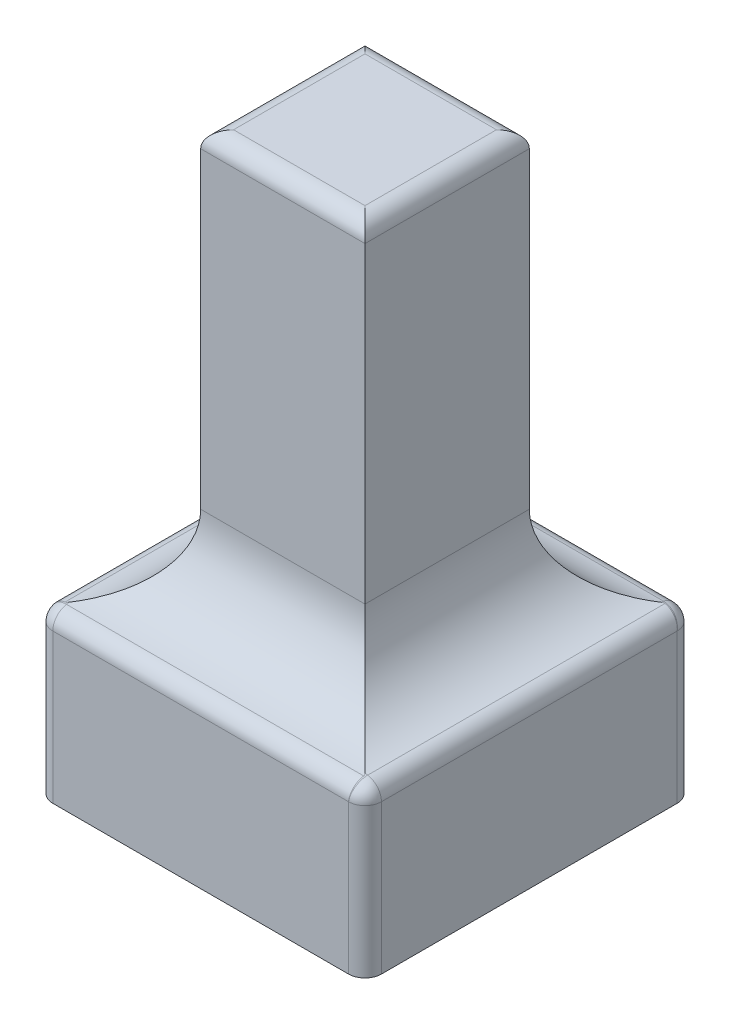
ISO-10303-21;
HEADER;
FILE_DESCRIPTION(('STEP AP214'),'2;1');
FILE_NAME('part.step','',(''),(''),'','','');
FILE_SCHEMA(('AUTOMOTIVE_DESIGN { 1 0 10303 214 1 1 1 1 }'));
ENDSEC;
DATA;
#1=APPLICATION_CONTEXT('core data for automotive mechanical design processes');
#2=APPLICATION_PROTOCOL_DEFINITION('international standard','automotive_design',2000,#1);
#3=PRODUCT_CONTEXT('',#1,'mechanical');
#4=PRODUCT('Part','Part','',(#3));
#5=PRODUCT_RELATED_PRODUCT_CATEGORY('part','',(#4));
#6=PRODUCT_DEFINITION_FORMATION('','',#4);
#7=PRODUCT_DEFINITION_CONTEXT('part definition',#1,'design');
#8=PRODUCT_DEFINITION('design','',#6,#7);
#9=PRODUCT_DEFINITION_SHAPE('','',#8);
#10=(LENGTH_UNIT() NAMED_UNIT(*) SI_UNIT(.MILLI.,.METRE.));
#11=(NAMED_UNIT(*) PLANE_ANGLE_UNIT() SI_UNIT($,.RADIAN.));
#12=(NAMED_UNIT(*) SI_UNIT($,.STERADIAN.) SOLID_ANGLE_UNIT());
#13=UNCERTAINTY_MEASURE_WITH_UNIT(LENGTH_MEASURE(1.E-05),#10,'distance_accuracy_value','');
#14=(GEOMETRIC_REPRESENTATION_CONTEXT(3) GLOBAL_UNCERTAINTY_ASSIGNED_CONTEXT((#13)) GLOBAL_UNIT_ASSIGNED_CONTEXT((#10,
#11,#12)) REPRESENTATION_CONTEXT('',''));
#15=CARTESIAN_POINT('',(0.,0.,0.));
#16=DIRECTION('',(0.,0.,1.));
#17=DIRECTION('',(1.,0.,0.));
#18=AXIS2_PLACEMENT_3D('',#15,#16,#17);
#19=CARTESIAN_POINT('',(10.,35.,10.));
#20=DIRECTION('',(-1.,0.,0.));
#21=DIRECTION('',(0.,0.,1.));
#22=AXIS2_PLACEMENT_3D('',#19,#20,#21);
#23=PLANE('',#22);
#24=DIRECTION('',(0.,-1.,0.));
#25=VECTOR('',#24,1.);
#26=CARTESIAN_POINT('',(10.,35.,-9.));
#27=LINE('',#26,#25);
#28=CARTESIAN_POINT('',(10.,0.,-9.));
#29=VERTEX_POINT('',#28);
#30=CARTESIAN_POINT('',(10.,9.08392021690038,-9.));
#31=VERTEX_POINT('',#30);
#32=EDGE_CURVE('E262',#29,#31,#27,.F.);
#33=ORIENTED_EDGE('',*,*,#32,.T.);
#34=DIRECTION('',(0.,0.,1.));
#35=VECTOR('',#34,1.);
#36=CARTESIAN_POINT('',(10.,9.08392021690038,10.));
#37=LINE('',#36,#35);
#38=CARTESIAN_POINT('',(10.,9.08392021690038,9.));
#39=VERTEX_POINT('',#38);
#40=EDGE_CURVE('E488',#31,#39,#37,.T.);
#41=ORIENTED_EDGE('',*,*,#40,.T.);
#42=DIRECTION('',(0.,-1.,0.));
#43=VECTOR('',#42,1.);
#44=CARTESIAN_POINT('',(10.,35.,9.));
#45=LINE('',#44,#43);
#46=CARTESIAN_POINT('',(10.,0.,9.));
#47=VERTEX_POINT('',#46);
#48=EDGE_CURVE('E260',#39,#47,#45,.T.);
#49=ORIENTED_EDGE('',*,*,#48,.T.);
#50=DIRECTION('',(0.,0.,-1.));
#51=VECTOR('',#50,1.);
#52=CARTESIAN_POINT('',(10.,0.,10.));
#53=LINE('',#52,#51);
#54=EDGE_CURVE('E772',#47,#29,#53,.T.);
#55=ORIENTED_EDGE('',*,*,#54,.T.);
#56=EDGE_LOOP('',(#33,#41,#49,#55));
#57=FACE_BOUND('',#56,.T.);
#58=ADVANCED_FACE('F36',(#57),#23,.F.);
#59=CARTESIAN_POINT('',(-9.99999999999999,35.,-10.));
#60=DIRECTION('',(0.,0.,1.));
#61=DIRECTION('',(1.,0.,0.));
#62=AXIS2_PLACEMENT_3D('',#59,#60,#61);
#63=PLANE('',#62);
#64=DIRECTION('',(0.,-1.,0.));
#65=VECTOR('',#64,1.);
#66=CARTESIAN_POINT('',(-8.99999999999999,35.,-10.));
#67=LINE('',#66,#65);
#68=CARTESIAN_POINT('',(-8.99999999999999,0.,-10.));
#69=VERTEX_POINT('',#68);
#70=CARTESIAN_POINT('',(-8.99999999999999,9.08392021690038,-10.));
#71=VERTEX_POINT('',#70);
#72=EDGE_CURVE('E248',#69,#71,#67,.F.);
#73=ORIENTED_EDGE('',*,*,#72,.T.);
#74=DIRECTION('',(1.,0.,0.));
#75=VECTOR('',#74,1.);
#76=CARTESIAN_POINT('',(-9.99999999999999,9.08392021690038,-10.));
#77=LINE('',#76,#75);
#78=CARTESIAN_POINT('',(9.00000000000001,9.08392021690038,-10.));
#79=VERTEX_POINT('',#78);
#80=EDGE_CURVE('E503',#71,#79,#77,.T.);
#81=ORIENTED_EDGE('',*,*,#80,.T.);
#82=DIRECTION('',(0.,-1.,0.));
#83=VECTOR('',#82,1.);
#84=CARTESIAN_POINT('',(9.00000000000001,35.,-10.));
#85=LINE('',#84,#83);
#86=CARTESIAN_POINT('',(9.00000000000001,0.,-10.));
#87=VERTEX_POINT('',#86);
#88=EDGE_CURVE('E250',#79,#87,#85,.T.);
#89=ORIENTED_EDGE('',*,*,#88,.T.);
#90=DIRECTION('',(-1.,0.,0.));
#91=VECTOR('',#90,1.);
#92=CARTESIAN_POINT('',(-9.99999999999999,0.,-10.));
#93=LINE('',#92,#91);
#94=EDGE_CURVE('E779',#87,#69,#93,.T.);
#95=ORIENTED_EDGE('',*,*,#94,.T.);
#96=EDGE_LOOP('',(#73,#81,#89,#95));
#97=FACE_BOUND('',#96,.T.);
#98=ADVANCED_FACE('F374',(#97),#63,.F.);
#99=CARTESIAN_POINT('',(-9.99999999999999,35.,10.));
#100=DIRECTION('',(1.,0.,0.));
#101=DIRECTION('',(0.,0.,-1.));
#102=AXIS2_PLACEMENT_3D('',#99,#100,#101);
#103=PLANE('',#102);
#104=DIRECTION('',(0.,-1.,0.));
#105=VECTOR('',#104,1.);
#106=CARTESIAN_POINT('',(-9.99999999999999,35.,9.));
#107=LINE('',#106,#105);
#108=CARTESIAN_POINT('',(-9.99999999999999,0.,9.));
#109=VERTEX_POINT('',#108);
#110=CARTESIAN_POINT('',(-9.99999999999999,9.08392021690038,9.));
#111=VERTEX_POINT('',#110);
#112=EDGE_CURVE('E272',#109,#111,#107,.F.);
#113=ORIENTED_EDGE('',*,*,#112,.T.);
#114=DIRECTION('',(0.,0.,-1.));
#115=VECTOR('',#114,1.);
#116=CARTESIAN_POINT('',(-9.99999999999999,9.08392021690038,10.));
#117=LINE('',#116,#115);
#118=CARTESIAN_POINT('',(-9.99999999999999,9.08392021690038,-9.));
#119=VERTEX_POINT('',#118);
#120=EDGE_CURVE('E12',#111,#119,#117,.T.);
#121=ORIENTED_EDGE('',*,*,#120,.T.);
#122=DIRECTION('',(0.,-1.,0.));
#123=VECTOR('',#122,1.);
#124=CARTESIAN_POINT('',(-9.99999999999999,35.,-9.));
#125=LINE('',#124,#123);
#126=CARTESIAN_POINT('',(-9.99999999999999,0.,-9.));
#127=VERTEX_POINT('',#126);
#128=EDGE_CURVE('E270',#119,#127,#125,.T.);
#129=ORIENTED_EDGE('',*,*,#128,.T.);
#130=DIRECTION('',(0.,0.,1.));
#131=VECTOR('',#130,1.);
#132=CARTESIAN_POINT('',(-9.99999999999999,0.,10.));
#133=LINE('',#132,#131);
#134=EDGE_CURVE('E218',#127,#109,#133,.T.);
#135=ORIENTED_EDGE('',*,*,#134,.T.);
#136=EDGE_LOOP('',(#113,#121,#129,#135));
#137=FACE_BOUND('',#136,.T.);
#138=ADVANCED_FACE('F380',(#137),#103,.F.);
#139=CARTESIAN_POINT('',(-9.99999999999999,35.,10.));
#140=DIRECTION('',(0.,0.,-1.));
#141=DIRECTION('',(-1.,0.,0.));
#142=AXIS2_PLACEMENT_3D('',#139,#140,#141);
#143=PLANE('',#142);
#144=DIRECTION('',(0.,-1.,0.));
#145=VECTOR('',#144,1.);
#146=CARTESIAN_POINT('',(9.00000000000001,35.,10.));
#147=LINE('',#146,#145);
#148=CARTESIAN_POINT('',(9.00000000000001,0.,10.));
#149=VERTEX_POINT('',#148);
#150=CARTESIAN_POINT('',(9.00000000000001,9.08392021690038,10.));
#151=VERTEX_POINT('',#150);
#152=EDGE_CURVE('E267',#149,#151,#147,.F.);
#153=ORIENTED_EDGE('',*,*,#152,.T.);
#154=DIRECTION('',(-1.,0.,0.));
#155=VECTOR('',#154,1.);
#156=CARTESIAN_POINT('',(-9.99999999999999,9.08392021690038,10.));
#157=LINE('',#156,#155);
#158=CARTESIAN_POINT('',(-8.99999999999999,9.08392021690038,10.));
#159=VERTEX_POINT('',#158);
#160=EDGE_CURVE('E45',#151,#159,#157,.T.);
#161=ORIENTED_EDGE('',*,*,#160,.T.);
#162=DIRECTION('',(0.,-1.,0.));
#163=VECTOR('',#162,1.);
#164=CARTESIAN_POINT('',(-8.99999999999999,35.,10.));
#165=LINE('',#164,#163);
#166=CARTESIAN_POINT('',(-8.99999999999999,0.,10.));
#167=VERTEX_POINT('',#166);
#168=EDGE_CURVE('E265',#159,#167,#165,.T.);
#169=ORIENTED_EDGE('',*,*,#168,.T.);
#170=DIRECTION('',(1.,0.,0.));
#171=VECTOR('',#170,1.);
#172=CARTESIAN_POINT('',(-9.99999999999999,0.,10.));
#173=LINE('',#172,#171);
#174=EDGE_CURVE('E215',#167,#149,#173,.T.);
#175=ORIENTED_EDGE('',*,*,#174,.T.);
#176=EDGE_LOOP('',(#153,#161,#169,#175));
#177=FACE_BOUND('',#176,.T.);
#178=ADVANCED_FACE('F483',(#177),#143,.F.);
#179=CARTESIAN_POINT('',(0.,0.,0.));
#180=DIRECTION('',(0.,-1.,0.));
#181=DIRECTION('',(0.,0.,-1.));
#182=AXIS2_PLACEMENT_3D('',#179,#180,#181);
#183=PLANE('',#182);
#184=ORIENTED_EDGE('',*,*,#94,.F.);
#185=CARTESIAN_POINT('',(9.00000000000001,0.,-9.));
#186=DIRECTION('',(0.,-1.,0.));
#187=DIRECTION('',(0.,0.,-1.));
#188=AXIS2_PLACEMENT_3D('',#185,#186,#187);
#189=CIRCLE('',#188,1.);
#190=EDGE_CURVE('E258',#87,#29,#189,.T.);
#191=ORIENTED_EDGE('',*,*,#190,.T.);
#192=ORIENTED_EDGE('',*,*,#54,.F.);
#193=CARTESIAN_POINT('',(9.00000000000001,0.,9.));
#194=DIRECTION('',(0.,-1.,0.));
#195=DIRECTION('',(0.,0.,-1.));
#196=AXIS2_PLACEMENT_3D('',#193,#194,#195);
#197=CIRCLE('',#196,1.);
#198=EDGE_CURVE('E256',#47,#149,#197,.T.);
#199=ORIENTED_EDGE('',*,*,#198,.T.);
#200=ORIENTED_EDGE('',*,*,#174,.F.);
#201=CARTESIAN_POINT('',(-8.99999999999999,0.,9.));
#202=DIRECTION('',(0.,-1.,0.));
#203=DIRECTION('',(0.,0.,-1.));
#204=AXIS2_PLACEMENT_3D('',#201,#202,#203);
#205=CIRCLE('',#204,1.);
#206=EDGE_CURVE('E254',#167,#109,#205,.T.);
#207=ORIENTED_EDGE('',*,*,#206,.T.);
#208=ORIENTED_EDGE('',*,*,#134,.F.);
#209=CARTESIAN_POINT('',(-8.99999999999999,0.,-9.));
#210=DIRECTION('',(0.,-1.,0.));
#211=DIRECTION('',(0.,0.,-1.));
#212=AXIS2_PLACEMENT_3D('',#209,#210,#211);
#213=CIRCLE('',#212,1.);
#214=EDGE_CURVE('E252',#127,#69,#213,.T.);
#215=ORIENTED_EDGE('',*,*,#214,.T.);
#216=EDGE_LOOP('',(#184,#191,#192,#199,#200,#207,#208,#215));
#217=FACE_BOUND('',#216,.T.);
#218=ADVANCED_FACE('F695',(#217),#183,.T.);
#219=CARTESIAN_POINT('',(-5.,35.,5.));
#220=DIRECTION('',(-1.,0.,0.));
#221=DIRECTION('',(0.,0.,1.));
#222=AXIS2_PLACEMENT_3D('',#219,#220,#221);
#223=PLANE('',#222);
#224=DIRECTION('',(0.,-1.,0.));
#225=VECTOR('',#224,1.);
#226=CARTESIAN_POINT('',(-5.,35.,5.));
#227=LINE('',#226,#225);
#228=CARTESIAN_POINT('',(-5.,34.,5.));
#229=VERTEX_POINT('',#228);
#230=CARTESIAN_POINT('',(-5.,15.,5.));
#231=VERTEX_POINT('',#230);
#232=EDGE_CURVE('E769',#229,#231,#227,.T.);
#233=ORIENTED_EDGE('',*,*,#232,.F.);
#234=DIRECTION('',(0.,0.,-1.));
#235=VECTOR('',#234,1.);
#236=CARTESIAN_POINT('',(-5.,34.,-5.));
#237=LINE('',#236,#235);
#238=CARTESIAN_POINT('',(-5.,34.,-5.));
#239=VERTEX_POINT('',#238);
#240=EDGE_CURVE('E226',#229,#239,#237,.T.);
#241=ORIENTED_EDGE('',*,*,#240,.T.);
#242=DIRECTION('',(0.,-1.,0.));
#243=VECTOR('',#242,1.);
#244=CARTESIAN_POINT('',(-5.,35.,-5.));
#245=LINE('',#244,#243);
#246=CARTESIAN_POINT('',(-5.,15.,-5.));
#247=VERTEX_POINT('',#246);
#248=EDGE_CURVE('E204',#239,#247,#245,.T.);
#249=ORIENTED_EDGE('',*,*,#248,.T.);
#250=DIRECTION('',(0.,0.,-1.));
#251=VECTOR('',#250,1.);
#252=CARTESIAN_POINT('',(-5.,15.,5.));
#253=LINE('',#252,#251);
#254=EDGE_CURVE('E223',#247,#231,#253,.F.);
#255=ORIENTED_EDGE('',*,*,#254,.T.);
#256=EDGE_LOOP('',(#233,#241,#249,#255));
#257=FACE_BOUND('',#256,.T.);
#258=ADVANCED_FACE('F686',(#257),#223,.T.);
#259=CARTESIAN_POINT('',(5.,35.,5.));
#260=DIRECTION('',(0.,0.,1.));
#261=DIRECTION('',(1.,0.,0.));
#262=AXIS2_PLACEMENT_3D('',#259,#260,#261);
#263=PLANE('',#262);
#264=DIRECTION('',(0.,-1.,0.));
#265=VECTOR('',#264,1.);
#266=CARTESIAN_POINT('',(5.,35.,5.));
#267=LINE('',#266,#265);
#268=CARTESIAN_POINT('',(5.,34.,5.));
#269=VERTEX_POINT('',#268);
#270=CARTESIAN_POINT('',(5.,15.,5.));
#271=VERTEX_POINT('',#270);
#272=EDGE_CURVE('E203',#269,#271,#267,.T.);
#273=ORIENTED_EDGE('',*,*,#272,.F.);
#274=DIRECTION('',(-1.,0.,0.));
#275=VECTOR('',#274,1.);
#276=CARTESIAN_POINT('',(-5.,34.,5.));
#277=LINE('',#276,#275);
#278=EDGE_CURVE('E244',#269,#229,#277,.T.);
#279=ORIENTED_EDGE('',*,*,#278,.T.);
#280=ORIENTED_EDGE('',*,*,#232,.T.);
#281=DIRECTION('',(-1.,0.,0.));
#282=VECTOR('',#281,1.);
#283=CARTESIAN_POINT('',(5.,15.,5.));
#284=LINE('',#283,#282);
#285=EDGE_CURVE('E210',#231,#271,#284,.F.);
#286=ORIENTED_EDGE('',*,*,#285,.T.);
#287=EDGE_LOOP('',(#273,#279,#280,#286));
#288=FACE_BOUND('',#287,.T.);
#289=ADVANCED_FACE('F678',(#288),#263,.T.);
#290=CARTESIAN_POINT('',(5.,35.,5.));
#291=DIRECTION('',(1.,0.,0.));
#292=DIRECTION('',(0.,0.,-1.));
#293=AXIS2_PLACEMENT_3D('',#290,#291,#292);
#294=PLANE('',#293);
#295=DIRECTION('',(0.,-1.,0.));
#296=VECTOR('',#295,1.);
#297=CARTESIAN_POINT('',(5.,35.,-5.));
#298=LINE('',#297,#296);
#299=CARTESIAN_POINT('',(5.,34.,-5.));
#300=VERTEX_POINT('',#299);
#301=CARTESIAN_POINT('',(5.,15.,-5.));
#302=VERTEX_POINT('',#301);
#303=EDGE_CURVE('E194',#300,#302,#298,.T.);
#304=ORIENTED_EDGE('',*,*,#303,.F.);
#305=DIRECTION('',(0.,0.,1.));
#306=VECTOR('',#305,1.);
#307=CARTESIAN_POINT('',(5.,34.,5.));
#308=LINE('',#307,#306);
#309=EDGE_CURVE('E246',#300,#269,#308,.T.);
#310=ORIENTED_EDGE('',*,*,#309,.T.);
#311=ORIENTED_EDGE('',*,*,#272,.T.);
#312=DIRECTION('',(0.,0.,1.));
#313=VECTOR('',#312,1.);
#314=CARTESIAN_POINT('',(5.,15.,5.));
#315=LINE('',#314,#313);
#316=EDGE_CURVE('E180',#271,#302,#315,.F.);
#317=ORIENTED_EDGE('',*,*,#316,.T.);
#318=EDGE_LOOP('',(#304,#310,#311,#317));
#319=FACE_BOUND('',#318,.T.);
#320=ADVANCED_FACE('F212',(#319),#294,.T.);
#321=CARTESIAN_POINT('',(5.,35.,-5.));
#322=DIRECTION('',(0.,0.,-1.));
#323=DIRECTION('',(-1.,0.,0.));
#324=AXIS2_PLACEMENT_3D('',#321,#322,#323);
#325=PLANE('',#324);
#326=ORIENTED_EDGE('',*,*,#248,.F.);
#327=DIRECTION('',(1.,0.,0.));
#328=VECTOR('',#327,1.);
#329=CARTESIAN_POINT('',(5.,34.,-5.));
#330=LINE('',#329,#328);
#331=EDGE_CURVE('E200',#239,#300,#330,.T.);
#332=ORIENTED_EDGE('',*,*,#331,.T.);
#333=ORIENTED_EDGE('',*,*,#303,.T.);
#334=DIRECTION('',(1.,0.,0.));
#335=VECTOR('',#334,1.);
#336=CARTESIAN_POINT('',(5.,15.,-5.));
#337=LINE('',#336,#335);
#338=EDGE_CURVE('E197',#302,#247,#337,.F.);
#339=ORIENTED_EDGE('',*,*,#338,.T.);
#340=EDGE_LOOP('',(#326,#332,#333,#339));
#341=FACE_BOUND('',#340,.T.);
#342=ADVANCED_FACE('F196',(#341),#325,.T.);
#343=CARTESIAN_POINT('',(0.,35.,0.));
#344=DIRECTION('',(0.,-1.,0.));
#345=DIRECTION('',(0.,0.,-1.));
#346=AXIS2_PLACEMENT_3D('',#343,#344,#345);
#347=PLANE('',#346);
#348=DIRECTION('',(1.,0.,0.));
#349=VECTOR('',#348,1.);
#350=CARTESIAN_POINT('',(-5.,35.,-4.));
#351=LINE('',#350,#349);
#352=CARTESIAN_POINT('',(4.,35.,-4.));
#353=VERTEX_POINT('',#352);
#354=CARTESIAN_POINT('',(-4.,35.,-4.));
#355=VERTEX_POINT('',#354);
#356=EDGE_CURVE('E238',#353,#355,#351,.F.);
#357=ORIENTED_EDGE('',*,*,#356,.T.);
#358=DIRECTION('',(0.,0.,-1.));
#359=VECTOR('',#358,1.);
#360=CARTESIAN_POINT('',(-4.,35.,5.));
#361=LINE('',#360,#359);
#362=CARTESIAN_POINT('',(-4.,35.,4.));
#363=VERTEX_POINT('',#362);
#364=EDGE_CURVE('E240',#355,#363,#361,.F.);
#365=ORIENTED_EDGE('',*,*,#364,.T.);
#366=DIRECTION('',(-1.,0.,0.));
#367=VECTOR('',#366,1.);
#368=CARTESIAN_POINT('',(5.,35.,4.));
#369=LINE('',#368,#367);
#370=CARTESIAN_POINT('',(4.,35.,4.));
#371=VERTEX_POINT('',#370);
#372=EDGE_CURVE('E236',#363,#371,#369,.F.);
#373=ORIENTED_EDGE('',*,*,#372,.T.);
#374=DIRECTION('',(0.,0.,1.));
#375=VECTOR('',#374,1.);
#376=CARTESIAN_POINT('',(4.,35.,-5.));
#377=LINE('',#376,#375);
#378=EDGE_CURVE('E234',#371,#353,#377,.F.);
#379=ORIENTED_EDGE('',*,*,#378,.T.);
#380=EDGE_LOOP('',(#357,#365,#373,#379));
#381=FACE_BOUND('',#380,.T.);
#382=ADVANCED_FACE('F310',(#381),#347,.F.);
#383=CARTESIAN_POINT('',(-10.,15.,0.));
#384=DIRECTION('',(0.,0.,-1.));
#385=DIRECTION('',(-1.,0.,0.));
#386=AXIS2_PLACEMENT_3D('',#383,#384,#385);
#387=CYLINDRICAL_SURFACE('',#386,5.);
#388=DIRECTION('',(0.,0.,-1.));
#389=VECTOR('',#388,1.);
#390=CARTESIAN_POINT('',(-9.16666666666666,10.0699335140837,0.));
#391=LINE('',#390,#389);
#392=CARTESIAN_POINT('',(-9.16666666666666,10.0699335140837,-9.));
#393=VERTEX_POINT('',#392);
#394=CARTESIAN_POINT('',(-9.16666666666666,10.0699335140837,9.08648639831284));
#395=VERTEX_POINT('',#394);
#396=EDGE_CURVE('E459',#393,#395,#391,.F.);
#397=ORIENTED_EDGE('',*,*,#396,.T.);
#398=CARTESIAN_POINT('',(-9.16666666666666,10.0699335140837,9.08648639831284));
#399=CARTESIAN_POINT('',(-9.15691104980442,10.0715815569293,9.08667140881188));
#400=CARTESIAN_POINT('',(-9.14720076619775,10.0732535997947,9.0858111619763));
#401=CARTESIAN_POINT('',(-9.12825881535897,10.0765707438093,9.0823568016696));
#402=CARTESIAN_POINT('',(-9.11902177747022,10.0782158113195,9.07979290185428));
#403=CARTESIAN_POINT('',(-9.09769381217422,10.0820733589025,9.07204841844918));
#404=CARTESIAN_POINT('',(-9.08583199316551,10.0842672224223,9.06624706583459));
#405=CARTESIAN_POINT('',(-9.06302348848499,10.0885630925247,9.05287278311464));
#406=CARTESIAN_POINT('',(-9.05208792103052,10.0906638688344,9.04528160611546));
#407=CARTESIAN_POINT('',(-9.02694409390195,10.0955755586257,9.02565272445987));
#408=CARTESIAN_POINT('',(-9.0131569092719,10.09833786359,9.01304524971691));
#409=CARTESIAN_POINT('',(-8.99999999999999,10.1010205144336,8.99999999999999));
#410=B_SPLINE_CURVE_WITH_KNOTS('',3,(#398,#399,#400,#401,#402,#403,#404,#405,#406,#407,#408,
#409),.UNSPECIFIED.,.F.,.F.,(4,2,2,2,2,4),(0.,0.0295449020278551,0.0585793423292182,
0.0985042523548703,0.138855273587335,0.195201680052563),.UNSPECIFIED.);
#411=CARTESIAN_POINT('',(-8.99999999999999,10.1010205144336,8.99999999999999));
#412=VERTEX_POINT('',#411);
#413=EDGE_CURVE('E315',#395,#412,#410,.T.);
#414=ORIENTED_EDGE('',*,*,#413,.T.);
#415=CARTESIAN_POINT('',(-10.,15.,10.));
#416=DIRECTION('',(-0.707106781186547,0.,-0.707106781186547));
#417=DIRECTION('',(0.707106781186547,0.,-0.707106781186547));
#418=AXIS2_PLACEMENT_3D('',#415,#416,#417);
#419=ELLIPSE('',#418,7.07106781186547,5.);
#420=EDGE_CURVE('E188',#231,#412,#419,.T.);
#421=ORIENTED_EDGE('',*,*,#420,.F.);
#422=ORIENTED_EDGE('',*,*,#254,.F.);
#423=CARTESIAN_POINT('',(-10.,15.,-10.));
#424=DIRECTION('',(0.707106781186547,0.,-0.707106781186547));
#425=DIRECTION('',(-0.707106781186547,0.,-0.707106781186547));
#426=AXIS2_PLACEMENT_3D('',#423,#424,#425);
#427=ELLIPSE('',#426,7.07106781186547,5.);
#428=CARTESIAN_POINT('',(-9.,10.1010205144336,-9.));
#429=VERTEX_POINT('',#428);
#430=EDGE_CURVE('E208',#429,#247,#427,.F.);
#431=ORIENTED_EDGE('',*,*,#430,.F.);
#432=CARTESIAN_POINT('',(-10.,15.,-9.));
#433=DIRECTION('',(0.,0.,1.));
#434=DIRECTION('',(1.,0.,0.));
#435=AXIS2_PLACEMENT_3D('',#432,#433,#434);
#436=CIRCLE('',#435,5.);
#437=EDGE_CURVE('E323',#429,#393,#436,.F.);
#438=ORIENTED_EDGE('',*,*,#437,.T.);
#439=EDGE_LOOP('',(#397,#414,#421,#422,#431,#438));
#440=FACE_BOUND('',#439,.T.);
#441=ADVANCED_FACE('F304',(#440),#387,.F.);
#442=CARTESIAN_POINT('',(0.,15.,-10.));
#443=DIRECTION('',(1.,0.,0.));
#444=DIRECTION('',(0.,0.,-1.));
#445=AXIS2_PLACEMENT_3D('',#442,#443,#444);
#446=CYLINDRICAL_SURFACE('',#445,5.);
#447=CARTESIAN_POINT('',(10.,15.,-10.));
#448=DIRECTION('',(0.707106781186547,0.,0.707106781186547));
#449=DIRECTION('',(0.707106781186547,0.,-0.707106781186547));
#450=AXIS2_PLACEMENT_3D('',#447,#448,#449);
#451=ELLIPSE('',#450,7.07106781186547,5.);
#452=CARTESIAN_POINT('',(9.,10.1010205144336,-9.));
#453=VERTEX_POINT('',#452);
#454=EDGE_CURVE('E175',#453,#302,#451,.F.);
#455=ORIENTED_EDGE('',*,*,#454,.F.);
#456=CARTESIAN_POINT('',(9.00000000000001,15.,-10.));
#457=DIRECTION('',(-1.,0.,0.));
#458=DIRECTION('',(0.,0.,1.));
#459=AXIS2_PLACEMENT_3D('',#456,#457,#458);
#460=CIRCLE('',#459,5.);
#461=CARTESIAN_POINT('',(9.00000000000001,10.0699335140837,-9.16666666666667));
#462=VERTEX_POINT('',#461);
#463=EDGE_CURVE('E293',#453,#462,#460,.F.);
#464=ORIENTED_EDGE('',*,*,#463,.T.);
#465=DIRECTION('',(1.,0.,0.));
#466=VECTOR('',#465,1.);
#467=CARTESIAN_POINT('',(0.,10.0699335140837,-9.16666666666667));
#468=LINE('',#467,#466);
#469=CARTESIAN_POINT('',(-9.08648639831285,10.0699335140837,-9.16666666666667));
#470=VERTEX_POINT('',#469);
#471=EDGE_CURVE('E274',#462,#470,#468,.F.);
#472=ORIENTED_EDGE('',*,*,#471,.T.);
#473=CARTESIAN_POINT('',(-9.08648639831285,10.0699335140837,-9.16666666666667));
#474=CARTESIAN_POINT('',(-9.08667140881189,10.0715815569293,-9.15691104980443));
#475=CARTESIAN_POINT('',(-9.08581116197631,10.0732535997947,-9.14720076619776));
#476=CARTESIAN_POINT('',(-9.08235680166961,10.0765707438093,-9.12825881535898));
#477=CARTESIAN_POINT('',(-9.07979290185429,10.0782158113195,-9.11902177747023));
#478=CARTESIAN_POINT('',(-9.07204841844919,10.0820733589025,-9.09769381217423));
#479=CARTESIAN_POINT('',(-9.0662470658346,10.0842672224223,-9.08583199316552));
#480=CARTESIAN_POINT('',(-9.05287278311465,10.0885630925247,-9.063023488485));
#481=CARTESIAN_POINT('',(-9.04528160611546,10.0906638688344,-9.05208792103053));
#482=CARTESIAN_POINT('',(-9.02565272445988,10.0955755586257,-9.02694409390196));
#483=CARTESIAN_POINT('',(-9.01304524971692,10.09833786359,-9.0131569092719));
#484=CARTESIAN_POINT('',(-9.,10.1010205144336,-9.));
#485=B_SPLINE_CURVE_WITH_KNOTS('',3,(#473,#474,#475,#476,#477,#478,#479,#480,#481,#482,#483,
#484),.UNSPECIFIED.,.F.,.F.,(4,2,2,2,2,4),(0.,0.0295449020278551,0.0585793423292182,
0.0985042523548688,0.138855273587331,0.195201680052564),.UNSPECIFIED.);
#486=EDGE_CURVE('E285',#470,#429,#485,.T.);
#487=ORIENTED_EDGE('',*,*,#486,.T.);
#488=ORIENTED_EDGE('',*,*,#430,.T.);
#489=ORIENTED_EDGE('',*,*,#338,.F.);
#490=EDGE_LOOP('',(#455,#464,#472,#487,#488,#489));
#491=FACE_BOUND('',#490,.T.);
#492=ADVANCED_FACE('F206',(#491),#446,.F.);
#493=CARTESIAN_POINT('',(0.,15.,10.));
#494=DIRECTION('',(-1.,0.,0.));
#495=DIRECTION('',(0.,0.,1.));
#496=AXIS2_PLACEMENT_3D('',#493,#494,#495);
#497=CYLINDRICAL_SURFACE('',#496,5.);
#498=DIRECTION('',(-1.,0.,0.));
#499=VECTOR('',#498,1.);
#500=CARTESIAN_POINT('',(0.,10.0699335140837,9.16666666666667));
#501=LINE('',#500,#499);
#502=CARTESIAN_POINT('',(-8.99999999999999,10.0699335140837,9.16666666666667));
#503=VERTEX_POINT('',#502);
#504=CARTESIAN_POINT('',(9.08648639831285,10.0699335140837,9.16666666666667));
#505=VERTEX_POINT('',#504);
#506=EDGE_CURVE('E472',#503,#505,#501,.F.);
#507=ORIENTED_EDGE('',*,*,#506,.T.);
#508=CARTESIAN_POINT('',(9.08648639831285,10.0699335140837,9.16666666666667));
#509=CARTESIAN_POINT('',(9.08667140881189,10.0715815569293,9.15691104980443));
#510=CARTESIAN_POINT('',(9.08581116197631,10.0732535997947,9.14720076619776));
#511=CARTESIAN_POINT('',(9.08235680166961,10.0765707438093,9.12825881535898));
#512=CARTESIAN_POINT('',(9.07979290185429,10.0782158113195,9.11902177747023));
#513=CARTESIAN_POINT('',(9.07204841844919,10.0820733589025,9.09769381217423));
#514=CARTESIAN_POINT('',(9.0662470658346,10.0842672224223,9.08583199316552));
#515=CARTESIAN_POINT('',(9.05287278311465,10.0885630925247,9.063023488485));
#516=CARTESIAN_POINT('',(9.04528160611546,10.0906638688344,9.05208792103053));
#517=CARTESIAN_POINT('',(9.02565272445988,10.0955755586257,9.02694409390196));
#518=CARTESIAN_POINT('',(9.01304524971692,10.09833786359,9.0131569092719));
#519=CARTESIAN_POINT('',(9.,10.1010205144336,9.));
#520=B_SPLINE_CURVE_WITH_KNOTS('',3,(#508,#509,#510,#511,#512,#513,#514,#515,#516,#517,#518,
#519),.UNSPECIFIED.,.F.,.F.,(4,2,2,2,2,4),(0.,0.0295449020278551,0.0585793423292182,
0.0985042523548688,0.138855273587331,0.195201680052564),.UNSPECIFIED.);
#521=CARTESIAN_POINT('',(9.,10.1010205144336,9.));
#522=VERTEX_POINT('',#521);
#523=EDGE_CURVE('E463',#505,#522,#520,.T.);
#524=ORIENTED_EDGE('',*,*,#523,.T.);
#525=CARTESIAN_POINT('',(10.,15.,10.));
#526=DIRECTION('',(-0.707106781186547,0.,0.707106781186547));
#527=DIRECTION('',(-0.707106781186547,0.,-0.707106781186547));
#528=AXIS2_PLACEMENT_3D('',#525,#526,#527);
#529=ELLIPSE('',#528,7.07106781186547,5.);
#530=EDGE_CURVE('E189',#271,#522,#529,.T.);
#531=ORIENTED_EDGE('',*,*,#530,.F.);
#532=ORIENTED_EDGE('',*,*,#285,.F.);
#533=ORIENTED_EDGE('',*,*,#420,.T.);
#534=CARTESIAN_POINT('',(-8.99999999999999,15.,10.));
#535=DIRECTION('',(1.,0.,0.));
#536=DIRECTION('',(0.,0.,-1.));
#537=AXIS2_PLACEMENT_3D('',#534,#535,#536);
#538=CIRCLE('',#537,5.);
#539=EDGE_CURVE('E471',#412,#503,#538,.F.);
#540=ORIENTED_EDGE('',*,*,#539,.T.);
#541=EDGE_LOOP('',(#507,#524,#531,#532,#533,#540));
#542=FACE_BOUND('',#541,.T.);
#543=ADVANCED_FACE('F303',(#542),#497,.F.);
#544=CARTESIAN_POINT('',(10.,15.,0.));
#545=DIRECTION('',(0.,0.,1.));
#546=DIRECTION('',(1.,0.,0.));
#547=AXIS2_PLACEMENT_3D('',#544,#545,#546);
#548=CYLINDRICAL_SURFACE('',#547,5.);
#549=DIRECTION('',(0.,0.,1.));
#550=VECTOR('',#549,1.);
#551=CARTESIAN_POINT('',(9.16666666666667,10.0699335140837,0.));
#552=LINE('',#551,#550);
#553=CARTESIAN_POINT('',(9.16666666666667,10.0699335140837,9.));
#554=VERTEX_POINT('',#553);
#555=CARTESIAN_POINT('',(9.16666666666667,10.0699335140837,-9.08648639831285));
#556=VERTEX_POINT('',#555);
#557=EDGE_CURVE('E491',#554,#556,#552,.F.);
#558=ORIENTED_EDGE('',*,*,#557,.T.);
#559=CARTESIAN_POINT('',(9.16666666666667,10.0699335140837,-9.08648639831285));
#560=CARTESIAN_POINT('',(9.15691104980443,10.0715815569293,-9.08667140881189));
#561=CARTESIAN_POINT('',(9.14720076619776,10.0732535997947,-9.08581116197631));
#562=CARTESIAN_POINT('',(9.12825881535898,10.0765707438093,-9.08235680166961));
#563=CARTESIAN_POINT('',(9.11902177747023,10.0782158113195,-9.07979290185429));
#564=CARTESIAN_POINT('',(9.09769381217424,10.0820733589025,-9.07204841844919));
#565=CARTESIAN_POINT('',(9.08583199316552,10.0842672224223,-9.0662470658346));
#566=CARTESIAN_POINT('',(9.063023488485,10.0885630925247,-9.05287278311465));
#567=CARTESIAN_POINT('',(9.05208792103054,10.0906638688344,-9.04528160611547));
#568=CARTESIAN_POINT('',(9.02694409390196,10.0955755586257,-9.02565272445988));
#569=CARTESIAN_POINT('',(9.01315690927191,10.09833786359,-9.01304524971692));
#570=CARTESIAN_POINT('',(9.00000000000001,10.1010205144336,-9.));
#571=B_SPLINE_CURVE_WITH_KNOTS('',3,(#559,#560,#561,#562,#563,#564,#565,#566,#567,#568,#569,
#570),.UNSPECIFIED.,.F.,.F.,(4,2,2,2,2,4),(0.,0.029544902027854,0.058579342329217,
0.0985042523548674,0.138855273587327,0.195201680052561),.UNSPECIFIED.);
#572=EDGE_CURVE('E183',#556,#453,#571,.T.);
#573=ORIENTED_EDGE('',*,*,#572,.T.);
#574=ORIENTED_EDGE('',*,*,#454,.T.);
#575=ORIENTED_EDGE('',*,*,#316,.F.);
#576=ORIENTED_EDGE('',*,*,#530,.T.);
#577=CARTESIAN_POINT('',(10.,15.,9.));
#578=DIRECTION('',(0.,0.,-1.));
#579=DIRECTION('',(-1.,0.,0.));
#580=AXIS2_PLACEMENT_3D('',#577,#578,#579);
#581=CIRCLE('',#580,5.);
#582=EDGE_CURVE('E396',#522,#554,#581,.F.);
#583=ORIENTED_EDGE('',*,*,#582,.T.);
#584=EDGE_LOOP('',(#558,#573,#574,#575,#576,#583));
#585=FACE_BOUND('',#584,.T.);
#586=ADVANCED_FACE('F177',(#585),#548,.F.);
#587=CARTESIAN_POINT('',(4.,34.,5.));
#588=DIRECTION('',(0.,0.,-1.));
#589=DIRECTION('',(-1.,0.,0.));
#590=AXIS2_PLACEMENT_3D('',#587,#588,#589);
#591=CYLINDRICAL_SURFACE('',#590,1.);
#592=CARTESIAN_POINT('',(4.,34.,-4.));
#593=DIRECTION('',(-0.707106781186547,0.,-0.707106781186547));
#594=DIRECTION('',(0.707106781186547,0.,-0.707106781186547));
#595=AXIS2_PLACEMENT_3D('',#592,#593,#594);
#596=ELLIPSE('',#595,1.41421356237309,1.);
#597=EDGE_CURVE('E279',#353,#300,#596,.T.);
#598=ORIENTED_EDGE('',*,*,#597,.F.);
#599=ORIENTED_EDGE('',*,*,#378,.F.);
#600=CARTESIAN_POINT('',(4.,34.,4.));
#601=DIRECTION('',(0.707106781186547,0.,-0.707106781186547));
#602=DIRECTION('',(-0.707106781186547,0.,-0.707106781186547));
#603=AXIS2_PLACEMENT_3D('',#600,#601,#602);
#604=ELLIPSE('',#603,1.41421356237309,1.);
#605=EDGE_CURVE('E227',#269,#371,#604,.F.);
#606=ORIENTED_EDGE('',*,*,#605,.F.);
#607=ORIENTED_EDGE('',*,*,#309,.F.);
#608=EDGE_LOOP('',(#598,#599,#606,#607));
#609=FACE_BOUND('',#608,.T.);
#610=ADVANCED_FACE('F386',(#609),#591,.T.);
#611=CARTESIAN_POINT('',(5.,34.,4.));
#612=DIRECTION('',(1.,0.,0.));
#613=DIRECTION('',(0.,0.,-1.));
#614=AXIS2_PLACEMENT_3D('',#611,#612,#613);
#615=CYLINDRICAL_SURFACE('',#614,1.);
#616=ORIENTED_EDGE('',*,*,#605,.T.);
#617=ORIENTED_EDGE('',*,*,#372,.F.);
#618=CARTESIAN_POINT('',(-4.,34.,4.));
#619=DIRECTION('',(0.707106781186547,0.,0.707106781186547));
#620=DIRECTION('',(0.707106781186547,0.,-0.707106781186547));
#621=AXIS2_PLACEMENT_3D('',#618,#619,#620);
#622=ELLIPSE('',#621,1.41421356237309,1.);
#623=EDGE_CURVE('E277',#229,#363,#622,.F.);
#624=ORIENTED_EDGE('',*,*,#623,.F.);
#625=ORIENTED_EDGE('',*,*,#278,.F.);
#626=EDGE_LOOP('',(#616,#617,#624,#625));
#627=FACE_BOUND('',#626,.T.);
#628=ADVANCED_FACE('F625',(#627),#615,.T.);
#629=CARTESIAN_POINT('',(5.,34.,-4.));
#630=DIRECTION('',(-1.,0.,0.));
#631=DIRECTION('',(0.,0.,1.));
#632=AXIS2_PLACEMENT_3D('',#629,#630,#631);
#633=CYLINDRICAL_SURFACE('',#632,1.);
#634=ORIENTED_EDGE('',*,*,#597,.T.);
#635=ORIENTED_EDGE('',*,*,#331,.F.);
#636=CARTESIAN_POINT('',(-4.,34.,-4.));
#637=DIRECTION('',(-0.707106781186547,0.,0.707106781186547));
#638=DIRECTION('',(-0.707106781186547,0.,-0.707106781186547));
#639=AXIS2_PLACEMENT_3D('',#636,#637,#638);
#640=ELLIPSE('',#639,1.41421356237309,1.);
#641=EDGE_CURVE('E275',#355,#239,#640,.T.);
#642=ORIENTED_EDGE('',*,*,#641,.F.);
#643=ORIENTED_EDGE('',*,*,#356,.F.);
#644=EDGE_LOOP('',(#634,#635,#642,#643));
#645=FACE_BOUND('',#644,.T.);
#646=ADVANCED_FACE('F617',(#645),#633,.T.);
#647=CARTESIAN_POINT('',(-4.,34.,5.));
#648=DIRECTION('',(0.,0.,1.));
#649=DIRECTION('',(1.,0.,0.));
#650=AXIS2_PLACEMENT_3D('',#647,#648,#649);
#651=CYLINDRICAL_SURFACE('',#650,1.);
#652=ORIENTED_EDGE('',*,*,#623,.T.);
#653=ORIENTED_EDGE('',*,*,#364,.F.);
#654=ORIENTED_EDGE('',*,*,#641,.T.);
#655=ORIENTED_EDGE('',*,*,#240,.F.);
#656=EDGE_LOOP('',(#652,#653,#654,#655));
#657=FACE_BOUND('',#656,.T.);
#658=ADVANCED_FACE('F312',(#657),#651,.T.);
#659=CARTESIAN_POINT('',(9.00000000000001,35.,-9.));
#660=DIRECTION('',(0.,-1.,0.));
#661=DIRECTION('',(0.,0.,-1.));
#662=AXIS2_PLACEMENT_3D('',#659,#660,#661);
#663=CYLINDRICAL_SURFACE('',#662,1.);
#664=ORIENTED_EDGE('',*,*,#88,.F.);
#665=CARTESIAN_POINT('',(9.00000000000001,9.08392021690038,-9.));
#666=DIRECTION('',(0.,-1.,0.));
#667=DIRECTION('',(0.,0.,-1.));
#668=AXIS2_PLACEMENT_3D('',#665,#666,#667);
#669=CIRCLE('',#668,1.);
#670=EDGE_CURVE('E493',#79,#31,#669,.T.);
#671=ORIENTED_EDGE('',*,*,#670,.T.);
#672=ORIENTED_EDGE('',*,*,#32,.F.);
#673=ORIENTED_EDGE('',*,*,#190,.F.);
#674=EDGE_LOOP('',(#664,#671,#672,#673));
#675=FACE_BOUND('',#674,.T.);
#676=ADVANCED_FACE('F601',(#675),#663,.T.);
#677=CARTESIAN_POINT('',(9.00000000000001,35.,9.));
#678=DIRECTION('',(0.,-1.,0.));
#679=DIRECTION('',(0.,0.,-1.));
#680=AXIS2_PLACEMENT_3D('',#677,#678,#679);
#681=CYLINDRICAL_SURFACE('',#680,1.);
#682=ORIENTED_EDGE('',*,*,#48,.F.);
#683=CARTESIAN_POINT('',(9.00000000000001,9.08392021690038,9.));
#684=DIRECTION('',(0.,-1.,0.));
#685=DIRECTION('',(0.,0.,-1.));
#686=AXIS2_PLACEMENT_3D('',#683,#684,#685);
#687=CIRCLE('',#686,1.);
#688=EDGE_CURVE('E395',#39,#151,#687,.T.);
#689=ORIENTED_EDGE('',*,*,#688,.T.);
#690=ORIENTED_EDGE('',*,*,#152,.F.);
#691=ORIENTED_EDGE('',*,*,#198,.F.);
#692=EDGE_LOOP('',(#682,#689,#690,#691));
#693=FACE_BOUND('',#692,.T.);
#694=ADVANCED_FACE('F479',(#693),#681,.T.);
#695=CARTESIAN_POINT('',(-8.99999999999999,35.,9.));
#696=DIRECTION('',(0.,-1.,0.));
#697=DIRECTION('',(0.,0.,-1.));
#698=AXIS2_PLACEMENT_3D('',#695,#696,#697);
#699=CYLINDRICAL_SURFACE('',#698,1.);
#700=ORIENTED_EDGE('',*,*,#168,.F.);
#701=CARTESIAN_POINT('',(-8.99999999999999,9.08392021690038,9.));
#702=DIRECTION('',(0.,-1.,0.));
#703=DIRECTION('',(0.,0.,-1.));
#704=AXIS2_PLACEMENT_3D('',#701,#702,#703);
#705=CIRCLE('',#704,1.);
#706=EDGE_CURVE('E462',#159,#111,#705,.T.);
#707=ORIENTED_EDGE('',*,*,#706,.T.);
#708=ORIENTED_EDGE('',*,*,#112,.F.);
#709=ORIENTED_EDGE('',*,*,#206,.F.);
#710=EDGE_LOOP('',(#700,#707,#708,#709));
#711=FACE_BOUND('',#710,.T.);
#712=ADVANCED_FACE('F587',(#711),#699,.T.);
#713=CARTESIAN_POINT('',(-8.99999999999999,35.,-9.));
#714=DIRECTION('',(0.,-1.,0.));
#715=DIRECTION('',(0.,0.,-1.));
#716=AXIS2_PLACEMENT_3D('',#713,#714,#715);
#717=CYLINDRICAL_SURFACE('',#716,1.);
#718=ORIENTED_EDGE('',*,*,#128,.F.);
#719=CARTESIAN_POINT('',(-8.99999999999999,9.08392021690038,-9.));
#720=DIRECTION('',(0.,-1.,0.));
#721=DIRECTION('',(0.,0.,-1.));
#722=AXIS2_PLACEMENT_3D('',#719,#720,#721);
#723=CIRCLE('',#722,1.);
#724=EDGE_CURVE('E58',#119,#71,#723,.T.);
#725=ORIENTED_EDGE('',*,*,#724,.T.);
#726=ORIENTED_EDGE('',*,*,#72,.F.);
#727=ORIENTED_EDGE('',*,*,#214,.F.);
#728=EDGE_LOOP('',(#718,#725,#726,#727));
#729=FACE_BOUND('',#728,.T.);
#730=ADVANCED_FACE('F330',(#729),#717,.T.);
#731=CARTESIAN_POINT('',(-8.99999999999999,15.,10.));
#732=DIRECTION('',(1.,0.,0.));
#733=DIRECTION('',(0.,0.,-1.));
#734=AXIS2_PLACEMENT_3D('',#731,#732,#733);
#735=TOROIDAL_SURFACE('',#734,6.,1.);
#736=CARTESIAN_POINT('',(-9.16666666666666,10.0699335140837,9.08648639831284));
#737=CARTESIAN_POINT('',(-9.19435822944474,10.0652526560882,9.08605644773808));
#738=CARTESIAN_POINT('',(-9.22183754356302,10.0594072980923,9.08551970351223));
#739=CARTESIAN_POINT('',(-9.27620154149852,10.0454300561119,9.08423791001986));
#740=CARTESIAN_POINT('',(-9.30308626264495,10.0372983161111,9.08349287387042));
#741=CARTESIAN_POINT('',(-9.3825102078851,10.0095669720983,9.08095597062815));
#742=CARTESIAN_POINT('',(-9.43391265291119,9.98661534541222,9.07886083921282));
#743=CARTESIAN_POINT('',(-9.53211687931298,9.93244950211877,9.07393926110143));
#744=CARTESIAN_POINT('',(-9.57891669735696,9.90123178024811,9.07111250416879));
#745=CARTESIAN_POINT('',(-9.66660001510477,9.83143711711266,9.06482820919335));
#746=CARTESIAN_POINT('',(-9.70748525205486,9.79286234452937,9.06137085704792));
#747=CARTESIAN_POINT('',(-9.78229644383315,9.70935079611432,9.05393377976702));
#748=CARTESIAN_POINT('',(-9.81620574599447,9.66439921989658,9.04995284101329));
#749=CARTESIAN_POINT('',(-9.8760263048442,9.56943872153804,9.04160144801046));
#750=CARTESIAN_POINT('',(-9.90193146332168,9.51942598170997,9.0372307000237));
#751=CARTESIAN_POINT('',(-9.94509146611058,9.41555615403628,9.0282189107579));
#752=CARTESIAN_POINT('',(-9.96230537108697,9.36168221239012,9.0235767031135));
#753=CARTESIAN_POINT('',(-9.98738803718452,9.25191113812547,9.01418751222002));
#754=CARTESIAN_POINT('',(-9.995280565917,9.19601952723038,9.00944082702066));
#755=CARTESIAN_POINT('',(-9.99918857094686,9.12642518574577,9.0035727487039));
#756=CARTESIAN_POINT('',(-9.99967200680259,9.11289396280849,9.00243379530519));
#757=CARTESIAN_POINT('',(-9.99996021068625,9.09421255685982,9.00086401616711));
#758=CARTESIAN_POINT('',(-9.99999991111284,9.08906658718674,9.00043188580737));
#759=CARTESIAN_POINT('',(-9.99999999999999,9.08392021690038,8.99999999999999));
#760=B_SPLINE_CURVE_WITH_KNOTS('',3,(#736,#737,#738,#739,#740,#741,#742,#743,#744,#745,#746,
#747,#748,#749,#750,#751,#752,#753,#754,#755,#756,#757,#758,#759),.UNSPECIFIED.,.F.,.F.,(4,2,2,
2,2,2,2,2,2,2,2,4),(0.,0.0842110369422024,0.168416771927457,0.336547491651002,0.504749622225274,
0.672902247278309,0.8414517371338,1.01012932691256,1.17959421242495,1.34862605764446,
1.38938345041343,1.40487584214071),.UNSPECIFIED.);
#761=EDGE_CURVE('E337',#111,#395,#760,.F.);
#762=ORIENTED_EDGE('',*,*,#761,.F.);
#763=CARTESIAN_POINT('',(-8.99999999999999,9.08392021690038,9.));
#764=DIRECTION('',(0.,-0.166666666666666,0.986013297183269));
#765=DIRECTION('',(0.,-0.98601329718327,-0.166666666666666));
#766=AXIS2_PLACEMENT_3D('',#763,#764,#765);
#767=CIRCLE('',#766,1.);
#768=EDGE_CURVE('E40',#503,#111,#767,.T.);
#769=ORIENTED_EDGE('',*,*,#768,.F.);
#770=ORIENTED_EDGE('',*,*,#539,.F.);
#771=ORIENTED_EDGE('',*,*,#413,.F.);
#772=EDGE_LOOP('',(#762,#769,#770,#771));
#773=FACE_BOUND('',#772,.T.);
#774=ADVANCED_FACE('F326',(#773),#735,.T.);
#775=CARTESIAN_POINT('',(-8.99999999999999,9.08392021690038,9.));
#776=DIRECTION('',(0.,-0.986013297183269,-0.166666666666666));
#777=DIRECTION('',(0.,0.166666666666667,-0.98601329718327));
#778=AXIS2_PLACEMENT_3D('',#775,#776,#777);
#779=SPHERICAL_SURFACE('',#778,1.);
#780=ORIENTED_EDGE('',*,*,#768,.T.);
#781=ORIENTED_EDGE('',*,*,#706,.F.);
#782=CARTESIAN_POINT('',(-8.99999999999999,9.08392021690038,9.));
#783=DIRECTION('',(1.,0.,0.));
#784=DIRECTION('',(0.,0.,-1.));
#785=AXIS2_PLACEMENT_3D('',#782,#783,#784);
#786=CIRCLE('',#785,1.);
#787=EDGE_CURVE('E344',#503,#159,#786,.T.);
#788=ORIENTED_EDGE('',*,*,#787,.F.);
#789=EDGE_LOOP('',(#780,#781,#788));
#790=FACE_BOUND('',#789,.T.);
#791=ADVANCED_FACE('F38',(#790),#779,.T.);
#792=CARTESIAN_POINT('',(-8.99999999999999,9.08392021690038,0.));
#793=DIRECTION('',(0.,0.,-1.));
#794=DIRECTION('',(-1.,0.,0.));
#795=AXIS2_PLACEMENT_3D('',#792,#793,#794);
#796=CYLINDRICAL_SURFACE('',#795,1.);
#797=ORIENTED_EDGE('',*,*,#761,.T.);
#798=ORIENTED_EDGE('',*,*,#396,.F.);
#799=CARTESIAN_POINT('',(-8.99999999999999,9.08392021690038,-9.));
#800=DIRECTION('',(0.,0.,-1.));
#801=DIRECTION('',(-1.,0.,0.));
#802=AXIS2_PLACEMENT_3D('',#799,#800,#801);
#803=CIRCLE('',#802,1.);
#804=EDGE_CURVE('E347',#119,#393,#803,.T.);
#805=ORIENTED_EDGE('',*,*,#804,.F.);
#806=ORIENTED_EDGE('',*,*,#120,.F.);
#807=EDGE_LOOP('',(#797,#798,#805,#806));
#808=FACE_BOUND('',#807,.T.);
#809=ADVANCED_FACE('F334',(#808),#796,.T.);
#810=CARTESIAN_POINT('',(0.,9.08392021690038,9.));
#811=DIRECTION('',(-1.,0.,0.));
#812=DIRECTION('',(0.,0.,1.));
#813=AXIS2_PLACEMENT_3D('',#810,#811,#812);
#814=CYLINDRICAL_SURFACE('',#813,1.);
#815=ORIENTED_EDGE('',*,*,#787,.T.);
#816=ORIENTED_EDGE('',*,*,#160,.F.);
#817=CARTESIAN_POINT('',(9.08648639831285,10.0699335140837,9.16666666666667));
#818=CARTESIAN_POINT('',(9.08605644773809,10.0652526560882,9.19435822944475));
#819=CARTESIAN_POINT('',(9.08551970351225,10.0594072980923,9.22183754356303));
#820=CARTESIAN_POINT('',(9.08423791001988,10.0454300561119,9.27620154149853));
#821=CARTESIAN_POINT('',(9.08349287387044,10.0372983161111,9.30308626264496));
#822=CARTESIAN_POINT('',(9.08095597062817,10.0095669720983,9.3825102078851));
#823=CARTESIAN_POINT('',(9.07886083921284,9.98661534541222,9.4339126529112));
#824=CARTESIAN_POINT('',(9.07393926110145,9.93244950211876,9.53211687931299));
#825=CARTESIAN_POINT('',(9.07111250416881,9.90123178024811,9.57891669735697));
#826=CARTESIAN_POINT('',(9.06482820919337,9.83143711711265,9.66660001510478));
#827=CARTESIAN_POINT('',(9.06137085704795,9.79286234452937,9.70748525205487));
#828=CARTESIAN_POINT('',(9.05393377976704,9.70935079611432,9.78229644383316));
#829=CARTESIAN_POINT('',(9.04995284101331,9.66439921989657,9.81620574599447));
#830=CARTESIAN_POINT('',(9.04160144801047,9.56943872153804,9.87602630484421));
#831=CARTESIAN_POINT('',(9.03723070002372,9.51942598170997,9.90193146332168));
#832=CARTESIAN_POINT('',(9.02821891075792,9.41555615403627,9.94509146611059));
#833=CARTESIAN_POINT('',(9.02357670311353,9.36168221239012,9.96230537108698));
#834=CARTESIAN_POINT('',(9.01418751222003,9.25191113812547,9.98738803718453));
#835=CARTESIAN_POINT('',(9.00944082702065,9.19601952723037,9.995280565917));
#836=CARTESIAN_POINT('',(9.00357274870395,9.12642518574576,9.99918857094686));
#837=CARTESIAN_POINT('',(9.00243379530525,9.11289396280848,9.9996720068026));
#838=CARTESIAN_POINT('',(9.00086401616716,9.09421255685982,9.99996021068626));
#839=CARTESIAN_POINT('',(9.00043188580741,9.08906658718674,9.99999991111284));
#840=CARTESIAN_POINT('',(9.00000000000001,9.08392021690038,10.));
#841=B_SPLINE_CURVE_WITH_KNOTS('',3,(#817,#818,#819,#820,#821,#822,#823,#824,#825,#826,#827,
#828,#829,#830,#831,#832,#833,#834,#835,#836,#837,#838,#839,#840),.UNSPECIFIED.,.F.,.F.,(4,2,2,
2,2,2,2,2,2,2,2,4),(0.,0.0842110369422008,0.168416771927457,0.336547491651002,0.504749622225274,
0.672902247278309,0.8414517371338,1.01012932691256,1.17959421242495,1.34862605764446,
1.38938345041343,1.40487584214071),.UNSPECIFIED.);
#842=EDGE_CURVE('E350',#505,#151,#841,.T.);
#843=ORIENTED_EDGE('',*,*,#842,.F.);
#844=ORIENTED_EDGE('',*,*,#506,.F.);
#845=EDGE_LOOP('',(#815,#816,#843,#844));
#846=FACE_BOUND('',#845,.T.);
#847=ADVANCED_FACE('F363',(#846),#814,.T.);
#848=CARTESIAN_POINT('',(-8.99999999999999,9.08392021690038,-9.));
#849=DIRECTION('',(0.166666666666668,-0.986013297183269,0.));
#850=DIRECTION('',(0.986013297183269,0.166666666666668,0.));
#851=AXIS2_PLACEMENT_3D('',#848,#849,#850);
#852=SPHERICAL_SURFACE('',#851,1.);
#853=ORIENTED_EDGE('',*,*,#724,.F.);
#854=ORIENTED_EDGE('',*,*,#804,.T.);
#855=CARTESIAN_POINT('',(-8.99999999999999,9.08392021690038,-9.));
#856=DIRECTION('',(0.986013297183269,0.166666666666668,0.));
#857=DIRECTION('',(-0.166666666666668,0.986013297183269,0.));
#858=AXIS2_PLACEMENT_3D('',#855,#856,#857);
#859=CIRCLE('',#858,1.);
#860=EDGE_CURVE('E358',#71,#393,#859,.T.);
#861=ORIENTED_EDGE('',*,*,#860,.F.);
#862=EDGE_LOOP('',(#853,#854,#861));
#863=FACE_BOUND('',#862,.T.);
#864=ADVANCED_FACE('F332',(#863),#852,.T.);
#865=CARTESIAN_POINT('',(10.,15.,9.));
#866=DIRECTION('',(0.,0.,-1.));
#867=DIRECTION('',(-1.,0.,0.));
#868=AXIS2_PLACEMENT_3D('',#865,#866,#867);
#869=TOROIDAL_SURFACE('',#868,6.,1.);
#870=ORIENTED_EDGE('',*,*,#523,.F.);
#871=ORIENTED_EDGE('',*,*,#842,.T.);
#872=CARTESIAN_POINT('',(9.00000000000001,9.08392021690038,9.));
#873=DIRECTION('',(0.98601329718327,-0.166666666666666,0.));
#874=DIRECTION('',(0.166666666666666,0.98601329718327,0.));
#875=AXIS2_PLACEMENT_3D('',#872,#873,#874);
#876=CIRCLE('',#875,1.);
#877=EDGE_CURVE('E432',#554,#151,#876,.T.);
#878=ORIENTED_EDGE('',*,*,#877,.F.);
#879=ORIENTED_EDGE('',*,*,#582,.F.);
#880=EDGE_LOOP('',(#870,#871,#878,#879));
#881=FACE_BOUND('',#880,.T.);
#882=ADVANCED_FACE('F360',(#881),#869,.T.);
#883=CARTESIAN_POINT('',(-10.,15.,-9.));
#884=DIRECTION('',(0.,0.,1.));
#885=DIRECTION('',(1.,0.,0.));
#886=AXIS2_PLACEMENT_3D('',#883,#884,#885);
#887=TOROIDAL_SURFACE('',#886,6.,1.);
#888=ORIENTED_EDGE('',*,*,#437,.F.);
#889=ORIENTED_EDGE('',*,*,#486,.F.);
#890=CARTESIAN_POINT('',(-9.08648639831285,10.0699335140837,-9.16666666666667));
#891=CARTESIAN_POINT('',(-9.08605644773809,10.0652526560882,-9.19435822944475));
#892=CARTESIAN_POINT('',(-9.08551970351225,10.0594072980923,-9.22183754356303));
#893=CARTESIAN_POINT('',(-9.08423791001988,10.0454300561119,-9.27620154149853));
#894=CARTESIAN_POINT('',(-9.08349287387044,10.0372983161111,-9.30308626264496));
#895=CARTESIAN_POINT('',(-9.08095597062817,10.0095669720983,-9.3825102078851));
#896=CARTESIAN_POINT('',(-9.07886083921284,9.98661534541222,-9.4339126529112));
#897=CARTESIAN_POINT('',(-9.07393926110145,9.93244950211876,-9.53211687931299));
#898=CARTESIAN_POINT('',(-9.07111250416881,9.90123178024811,-9.57891669735697));
#899=CARTESIAN_POINT('',(-9.06482820919337,9.83143711711265,-9.66660001510478));
#900=CARTESIAN_POINT('',(-9.06137085704794,9.79286234452937,-9.70748525205487));
#901=CARTESIAN_POINT('',(-9.05393377976704,9.70935079611432,-9.78229644383316));
#902=CARTESIAN_POINT('',(-9.04995284101332,9.66439921989657,-9.81620574599447));
#903=CARTESIAN_POINT('',(-9.04160144801047,9.56943872153804,-9.87602630484421));
#904=CARTESIAN_POINT('',(-9.03723070002372,9.51942598170997,-9.90193146332168));
#905=CARTESIAN_POINT('',(-9.02821891075792,9.41555615403627,-9.94509146611059));
#906=CARTESIAN_POINT('',(-9.02357670311353,9.36168221239012,-9.96230537108698));
#907=CARTESIAN_POINT('',(-9.01418751222004,9.25191113812547,-9.98738803718453));
#908=CARTESIAN_POINT('',(-9.00944082702066,9.19601952723037,-9.995280565917));
#909=CARTESIAN_POINT('',(-9.00357274870395,9.12642518574576,-9.99918857094686));
#910=CARTESIAN_POINT('',(-9.00243379530525,9.11289396280849,-9.9996720068026));
#911=CARTESIAN_POINT('',(-9.00086401616716,9.09421255685982,-9.99996021068626));
#912=CARTESIAN_POINT('',(-9.00043188580741,9.08906658718674,-9.99999991111284));
#913=CARTESIAN_POINT('',(-9.00000000000001,9.08392021690038,-10.));
#914=B_SPLINE_CURVE_WITH_KNOTS('',3,(#890,#891,#892,#893,#894,#895,#896,#897,#898,#899,#900,
#901,#902,#903,#904,#905,#906,#907,#908,#909,#910,#911,#912,#913),.UNSPECIFIED.,.F.,.F.,(4,2,2,
2,2,2,2,2,2,2,2,4),(0.,0.0842110369422008,0.168416771927457,0.336547491651002,0.504749622225274,
0.672902247278309,0.8414517371338,1.01012932691256,1.17959421242495,1.34862605764446,
1.38938345041343,1.40487584214071),.UNSPECIFIED.);
#915=EDGE_CURVE('E426',#71,#470,#914,.F.);
#916=ORIENTED_EDGE('',*,*,#915,.F.);
#917=ORIENTED_EDGE('',*,*,#860,.T.);
#918=EDGE_LOOP('',(#888,#889,#916,#917));
#919=FACE_BOUND('',#918,.T.);
#920=ADVANCED_FACE('F295',(#919),#887,.T.);
#921=CARTESIAN_POINT('',(9.00000000000001,9.08392021690038,9.));
#922=DIRECTION('',(-0.166666666666666,-0.986013297183269,0.));
#923=DIRECTION('',(0.98601329718327,-0.166666666666666,0.));
#924=AXIS2_PLACEMENT_3D('',#921,#922,#923);
#925=SPHERICAL_SURFACE('',#924,1.);
#926=ORIENTED_EDGE('',*,*,#877,.T.);
#927=ORIENTED_EDGE('',*,*,#688,.F.);
#928=CARTESIAN_POINT('',(9.00000000000001,9.08392021690038,9.));
#929=DIRECTION('',(0.,0.,-1.));
#930=DIRECTION('',(-1.,0.,0.));
#931=AXIS2_PLACEMENT_3D('',#928,#929,#930);
#932=CIRCLE('',#931,1.);
#933=EDGE_CURVE('E423',#554,#39,#932,.T.);
#934=ORIENTED_EDGE('',*,*,#933,.F.);
#935=EDGE_LOOP('',(#926,#927,#934));
#936=FACE_BOUND('',#935,.T.);
#937=ADVANCED_FACE('F436',(#936),#925,.T.);
#938=CARTESIAN_POINT('',(0.,9.08392021690038,-9.));
#939=DIRECTION('',(1.,0.,0.));
#940=DIRECTION('',(0.,0.,-1.));
#941=AXIS2_PLACEMENT_3D('',#938,#939,#940);
#942=CYLINDRICAL_SURFACE('',#941,1.);
#943=ORIENTED_EDGE('',*,*,#915,.T.);
#944=ORIENTED_EDGE('',*,*,#471,.F.);
#945=CARTESIAN_POINT('',(9.00000000000001,9.08392021690038,-9.));
#946=DIRECTION('',(1.,0.,0.));
#947=DIRECTION('',(0.,0.,-1.));
#948=AXIS2_PLACEMENT_3D('',#945,#946,#947);
#949=CIRCLE('',#948,1.);
#950=EDGE_CURVE('E419',#79,#462,#949,.T.);
#951=ORIENTED_EDGE('',*,*,#950,.F.);
#952=ORIENTED_EDGE('',*,*,#80,.F.);
#953=EDGE_LOOP('',(#943,#944,#951,#952));
#954=FACE_BOUND('',#953,.T.);
#955=ADVANCED_FACE('F433',(#954),#942,.T.);
#956=CARTESIAN_POINT('',(9.00000000000001,9.08392021690038,0.));
#957=DIRECTION('',(0.,0.,1.));
#958=DIRECTION('',(1.,0.,0.));
#959=AXIS2_PLACEMENT_3D('',#956,#957,#958);
#960=CYLINDRICAL_SURFACE('',#959,1.);
#961=ORIENTED_EDGE('',*,*,#933,.T.);
#962=ORIENTED_EDGE('',*,*,#40,.F.);
#963=CARTESIAN_POINT('',(9.16666666666667,10.0699335140837,-9.08648639831285));
#964=CARTESIAN_POINT('',(9.19435822944475,10.0652526560882,-9.08605644773809));
#965=CARTESIAN_POINT('',(9.22183754356303,10.0594072980923,-9.08551970351225));
#966=CARTESIAN_POINT('',(9.27620154149853,10.0454300561119,-9.08423791001987));
#967=CARTESIAN_POINT('',(9.30308626264496,10.0372983161111,-9.08349287387044));
#968=CARTESIAN_POINT('',(9.38251020788511,10.0095669720983,-9.08095597062817));
#969=CARTESIAN_POINT('',(9.4339126529112,9.98661534541222,-9.07886083921284));
#970=CARTESIAN_POINT('',(9.53211687931299,9.93244950211876,-9.07393926110145));
#971=CARTESIAN_POINT('',(9.57891669735697,9.90123178024811,-9.07111250416881));
#972=CARTESIAN_POINT('',(9.66660001510478,9.83143711711265,-9.06482820919337));
#973=CARTESIAN_POINT('',(9.70748525205487,9.79286234452937,-9.06137085704795));
#974=CARTESIAN_POINT('',(9.78229644383316,9.70935079611432,-9.05393377976704));
#975=CARTESIAN_POINT('',(9.81620574599447,9.66439921989658,-9.04995284101332));
#976=CARTESIAN_POINT('',(9.87602630484421,9.56943872153804,-9.04160144801047));
#977=CARTESIAN_POINT('',(9.90193146332169,9.51942598170998,-9.03723070002371));
#978=CARTESIAN_POINT('',(9.94509146611059,9.41555615403628,-9.02821891075794));
#979=CARTESIAN_POINT('',(9.96230537108698,9.36168221239012,-9.02357670311356));
#980=CARTESIAN_POINT('',(9.98738803718454,9.25191113812547,-9.01418751221999));
#981=CARTESIAN_POINT('',(9.99528056591701,9.19601952723039,-9.00944082702052));
#982=CARTESIAN_POINT('',(9.99918857094686,9.12642518574577,-9.00357274870393));
#983=CARTESIAN_POINT('',(9.9996720068026,9.11289396280849,-9.00243379530527));
#984=CARTESIAN_POINT('',(9.99996021068626,9.09421255685982,-9.00086401616717));
#985=CARTESIAN_POINT('',(9.99999991111285,9.08906658718674,-9.00043188580742));
#986=CARTESIAN_POINT('',(10.,9.08392021690038,-9.00000000000001));
#987=B_SPLINE_CURVE_WITH_KNOTS('',3,(#963,#964,#965,#966,#967,#968,#969,#970,#971,#972,#973,
#974,#975,#976,#977,#978,#979,#980,#981,#982,#983,#984,#985,#986),.UNSPECIFIED.,.F.,.F.,(4,2,2,
2,2,2,2,2,2,2,2,4),(0.,0.0842110369422027,0.168416771927457,0.336547491651002,0.504749622225274,
0.672902247278306,0.841451737133798,1.01012932691256,1.17959421242495,1.34862605764446,
1.38938345041343,1.40487584214071),.UNSPECIFIED.);
#988=EDGE_CURVE('E411',#556,#31,#987,.T.);
#989=ORIENTED_EDGE('',*,*,#988,.F.);
#990=ORIENTED_EDGE('',*,*,#557,.F.);
#991=EDGE_LOOP('',(#961,#962,#989,#990));
#992=FACE_BOUND('',#991,.T.);
#993=ADVANCED_FACE('F407',(#992),#960,.T.);
#994=CARTESIAN_POINT('',(9.00000000000001,9.08392021690038,-9.));
#995=DIRECTION('',(0.,-0.986013297183269,0.166666666666666));
#996=DIRECTION('',(0.,-0.166666666666667,-0.98601329718327));
#997=AXIS2_PLACEMENT_3D('',#994,#995,#996);
#998=SPHERICAL_SURFACE('',#997,1.);
#999=ORIENTED_EDGE('',*,*,#670,.F.);
#1000=ORIENTED_EDGE('',*,*,#950,.T.);
#1001=CARTESIAN_POINT('',(9.00000000000001,9.08392021690038,-9.));
#1002=DIRECTION('',(0.,0.166666666666666,0.986013297183269));
#1003=DIRECTION('',(0.,-0.98601329718327,0.166666666666666));
#1004=AXIS2_PLACEMENT_3D('',#1001,#1002,#1003);
#1005=CIRCLE('',#1004,1.);
#1006=EDGE_CURVE('E420',#31,#462,#1005,.T.);
#1007=ORIENTED_EDGE('',*,*,#1006,.F.);
#1008=EDGE_LOOP('',(#999,#1000,#1007));
#1009=FACE_BOUND('',#1008,.T.);
#1010=ADVANCED_FACE('F404',(#1009),#998,.T.);
#1011=CARTESIAN_POINT('',(9.00000000000001,15.,-10.));
#1012=DIRECTION('',(-1.,0.,0.));
#1013=DIRECTION('',(0.,0.,1.));
#1014=AXIS2_PLACEMENT_3D('',#1011,#1012,#1013);
#1015=TOROIDAL_SURFACE('',#1014,6.,1.);
#1016=ORIENTED_EDGE('',*,*,#572,.F.);
#1017=ORIENTED_EDGE('',*,*,#988,.T.);
#1018=ORIENTED_EDGE('',*,*,#1006,.T.);
#1019=ORIENTED_EDGE('',*,*,#463,.F.);
#1020=EDGE_LOOP('',(#1016,#1017,#1018,#1019));
#1021=FACE_BOUND('',#1020,.T.);
#1022=ADVANCED_FACE('F399',(#1021),#1015,.T.);
#1023=CLOSED_SHELL('',(#58,#98,#138,#178,#218,#258,#289,#320,#342,#382,#441,#492,#543,#586,#610,
#628,#646,#658,#676,#694,#712,#730,#774,#791,#809,#847,#864,#882,#920,#937,#955,#993,#1010,#1022));
#1024=MANIFOLD_SOLID_BREP('B2',#1023);
#1025=ADVANCED_BREP_SHAPE_REPRESENTATION('',(#18,#1024),#14);
#1026=SHAPE_DEFINITION_REPRESENTATION(#9,#1025);
ENDSEC;
END-ISO-10303-21;
